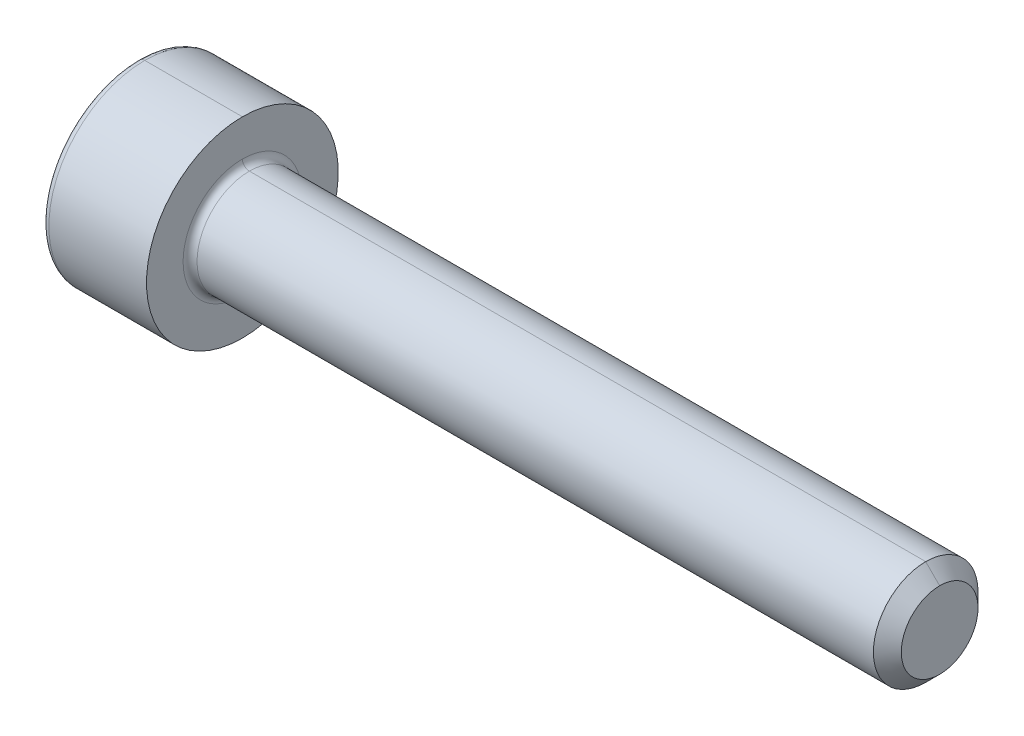
ISO-10303-21;
HEADER;
FILE_DESCRIPTION(('STEP AP214'),'2;1');
FILE_NAME('part.step','',(''),(''),'','','');
FILE_SCHEMA(('AUTOMOTIVE_DESIGN { 1 0 10303 214 1 1 1 1 }'));
ENDSEC;
DATA;
#1=APPLICATION_CONTEXT('core data for automotive mechanical design processes');
#2=APPLICATION_PROTOCOL_DEFINITION('international standard','automotive_design',2000,#1);
#3=PRODUCT_CONTEXT('',#1,'mechanical');
#4=PRODUCT('Part','Part','',(#3));
#5=PRODUCT_RELATED_PRODUCT_CATEGORY('part','',(#4));
#6=PRODUCT_DEFINITION_FORMATION('','',#4);
#7=PRODUCT_DEFINITION_CONTEXT('part definition',#1,'design');
#8=PRODUCT_DEFINITION('design','',#6,#7);
#9=PRODUCT_DEFINITION_SHAPE('','',#8);
#10=(LENGTH_UNIT() NAMED_UNIT(*) SI_UNIT(.MILLI.,.METRE.));
#11=(NAMED_UNIT(*) PLANE_ANGLE_UNIT() SI_UNIT($,.RADIAN.));
#12=(NAMED_UNIT(*) SI_UNIT($,.STERADIAN.) SOLID_ANGLE_UNIT());
#13=UNCERTAINTY_MEASURE_WITH_UNIT(LENGTH_MEASURE(1.E-05),#10,'distance_accuracy_value','');
#14=(GEOMETRIC_REPRESENTATION_CONTEXT(3) GLOBAL_UNCERTAINTY_ASSIGNED_CONTEXT((#13)) GLOBAL_UNIT_ASSIGNED_CONTEXT((#10,
#11,#12)) REPRESENTATION_CONTEXT('',''));
#15=CARTESIAN_POINT('',(0.,0.,0.));
#16=DIRECTION('',(0.,0.,1.));
#17=DIRECTION('',(1.,0.,0.));
#18=AXIS2_PLACEMENT_3D('',#15,#16,#17);
#19=CARTESIAN_POINT('',(1.50000000000084,3.74700270810991E-13,-3.74700270810991E-13));
#20=DIRECTION('',(-1.,0.,0.));
#21=DIRECTION('',(0.,0.,1.));
#22=AXIS2_PLACEMENT_3D('',#19,#20,#21);
#23=PLANE('',#22);
#24=DIRECTION('',(0.,-0.866025403784439,0.5));
#25=VECTOR('',#24,1.);
#26=CARTESIAN_POINT('',(1.50000000000105,9.85322934354826E-13,-1.44337567297408));
#27=LINE('',#26,#25);
#28=CARTESIAN_POINT('',(1.50000000000105,9.85322934354826E-13,-1.44337567297408));
#29=VERTEX_POINT('',#28);
#30=CARTESIAN_POINT('',(1.50000000000028,-1.24999999999915,-0.721687836487003));
#31=VERTEX_POINT('',#30);
#32=EDGE_CURVE('E254',#29,#31,#27,.T.);
#33=ORIENTED_EDGE('',*,*,#32,.T.);
#34=DIRECTION('',(0.,0.,1.));
#35=VECTOR('',#34,1.);
#36=CARTESIAN_POINT('',(1.50000000000028,-1.24999999999915,-0.721687836487003));
#37=LINE('',#36,#35);
#38=CARTESIAN_POINT('',(1.50000000000039,-1.24999999999961,0.721687836486698));
#39=VERTEX_POINT('',#38);
#40=EDGE_CURVE('E11',#31,#39,#37,.T.);
#41=ORIENTED_EDGE('',*,*,#40,.T.);
#42=DIRECTION('',(0.,0.86602540378444,0.5));
#43=VECTOR('',#42,1.);
#44=CARTESIAN_POINT('',(1.50000000000039,-1.24999999999961,0.721687836486698));
#45=LINE('',#44,#43);
#46=CARTESIAN_POINT('',(1.5000000000005,7.49400541621981E-13,1.44337567297381));
#47=VERTEX_POINT('',#46);
#48=EDGE_CURVE('E43',#39,#47,#45,.T.);
#49=ORIENTED_EDGE('',*,*,#48,.T.);
#50=DIRECTION('',(0.,0.866025403784439,-0.5));
#51=VECTOR('',#50,1.);
#52=CARTESIAN_POINT('',(1.5000000000005,7.49400541621981E-13,1.44337567297381));
#53=LINE('',#52,#51);
#54=CARTESIAN_POINT('',(1.50000000000072,1.25000000000063,0.721687836486684));
#55=VERTEX_POINT('',#54);
#56=EDGE_CURVE('E287',#47,#55,#53,.T.);
#57=ORIENTED_EDGE('',*,*,#56,.T.);
#58=DIRECTION('',(0.,0.,-1.));
#59=VECTOR('',#58,1.);
#60=CARTESIAN_POINT('',(1.50000000000072,1.25000000000063,0.721687836486684));
#61=LINE('',#60,#59);
#62=CARTESIAN_POINT('',(1.50000000000105,1.25000000000044,-0.721687836486976));
#63=VERTEX_POINT('',#62);
#64=EDGE_CURVE('E269',#55,#63,#61,.T.);
#65=ORIENTED_EDGE('',*,*,#64,.T.);
#66=DIRECTION('',(0.,-0.866025403784439,-0.5));
#67=VECTOR('',#66,1.);
#68=CARTESIAN_POINT('',(1.50000000000105,1.25000000000044,-0.721687836486976));
#69=LINE('',#68,#67);
#70=EDGE_CURVE('E247',#63,#29,#69,.T.);
#71=ORIENTED_EDGE('',*,*,#70,.T.);
#72=EDGE_LOOP('',(#33,#41,#49,#57,#65,#71));
#73=FACE_BOUND('',#72,.T.);
#74=ADVANCED_FACE('F16',(#73),#23,.T.);
#75=CARTESIAN_POINT('',(1.50000000000028,-1.24999999999915,-0.721687836487003));
#76=DIRECTION('',(0.,-1.,0.));
#77=DIRECTION('',(-1.,0.,0.));
#78=AXIS2_PLACEMENT_3D('',#75,#76,#77);
#79=PLANE('',#78);
#80=DIRECTION('',(0.,0.,1.));
#81=VECTOR('',#80,1.);
#82=CARTESIAN_POINT('',(8.88178419700125E-13,-1.2499999999995,-0.721687836486781));
#83=LINE('',#82,#81);
#84=CARTESIAN_POINT('',(8.88178419700125E-13,-1.2499999999995,-0.721687836486781));
#85=VERTEX_POINT('',#84);
#86=CARTESIAN_POINT('',(7.7715611723761E-13,-1.24999999999904,0.721687836486989));
#87=VERTEX_POINT('',#86);
#88=EDGE_CURVE('E258',#85,#87,#83,.T.);
#89=ORIENTED_EDGE('',*,*,#88,.T.);
#90=DIRECTION('',(-1.,0.,0.));
#91=VECTOR('',#90,1.);
#92=CARTESIAN_POINT('',(1.50000000000039,-1.24999999999961,0.721687836486698));
#93=LINE('',#92,#91);
#94=EDGE_CURVE('E24',#39,#87,#93,.T.);
#95=ORIENTED_EDGE('',*,*,#94,.F.);
#96=ORIENTED_EDGE('',*,*,#40,.F.);
#97=DIRECTION('',(-1.,0.,0.));
#98=VECTOR('',#97,1.);
#99=CARTESIAN_POINT('',(1.50000000000028,-1.24999999999915,-0.721687836487003));
#100=LINE('',#99,#98);
#101=EDGE_CURVE('E151',#31,#85,#100,.T.);
#102=ORIENTED_EDGE('',*,*,#101,.T.);
#103=EDGE_LOOP('',(#89,#95,#96,#102));
#104=FACE_BOUND('',#103,.T.);
#105=ADVANCED_FACE('F476',(#104),#79,.F.);
#106=CARTESIAN_POINT('',(1.50000000000039,-1.24999999999961,0.721687836486698));
#107=DIRECTION('',(0.,-0.5,0.86602540378444));
#108=DIRECTION('',(-1.,0.,0.));
#109=AXIS2_PLACEMENT_3D('',#106,#107,#108);
#110=PLANE('',#109);
#111=DIRECTION('',(0.,0.86602540378444,0.5));
#112=VECTOR('',#111,1.);
#113=CARTESIAN_POINT('',(7.7715611723761E-13,-1.24999999999904,0.721687836486989));
#114=LINE('',#113,#112);
#115=CARTESIAN_POINT('',(-2.22044604925032E-13,0.,1.44337567297408));
#116=VERTEX_POINT('',#115);
#117=EDGE_CURVE('E246',#87,#116,#114,.T.);
#118=ORIENTED_EDGE('',*,*,#117,.T.);
#119=DIRECTION('',(-1.,0.,0.));
#120=VECTOR('',#119,1.);
#121=CARTESIAN_POINT('',(1.5000000000005,7.49400541621981E-13,1.44337567297381));
#122=LINE('',#121,#120);
#123=EDGE_CURVE('E290',#47,#116,#122,.T.);
#124=ORIENTED_EDGE('',*,*,#123,.F.);
#125=ORIENTED_EDGE('',*,*,#48,.F.);
#126=ORIENTED_EDGE('',*,*,#94,.T.);
#127=EDGE_LOOP('',(#118,#124,#125,#126));
#128=FACE_BOUND('',#127,.T.);
#129=ADVANCED_FACE('F466',(#128),#110,.F.);
#130=CARTESIAN_POINT('',(1.5000000000005,7.49400541621981E-13,1.44337567297381));
#131=DIRECTION('',(0.,0.5,0.866025403784439));
#132=DIRECTION('',(1.,0.,0.));
#133=AXIS2_PLACEMENT_3D('',#130,#131,#132);
#134=PLANE('',#133);
#135=DIRECTION('',(0.,0.866025403784439,-0.5));
#136=VECTOR('',#135,1.);
#137=CARTESIAN_POINT('',(-2.22044604925032E-13,0.,1.44337567297408));
#138=LINE('',#137,#136);
#139=CARTESIAN_POINT('',(5.55111512312578E-13,1.25000000000058,0.721687836486684));
#140=VERTEX_POINT('',#139);
#141=EDGE_CURVE('E242',#116,#140,#138,.T.);
#142=ORIENTED_EDGE('',*,*,#141,.T.);
#143=DIRECTION('',(-1.,0.,0.));
#144=VECTOR('',#143,1.);
#145=CARTESIAN_POINT('',(1.50000000000072,1.25000000000063,0.721687836486684));
#146=LINE('',#145,#144);
#147=EDGE_CURVE('E272',#55,#140,#146,.T.);
#148=ORIENTED_EDGE('',*,*,#147,.F.);
#149=ORIENTED_EDGE('',*,*,#56,.F.);
#150=ORIENTED_EDGE('',*,*,#123,.T.);
#151=EDGE_LOOP('',(#142,#148,#149,#150));
#152=FACE_BOUND('',#151,.T.);
#153=ADVANCED_FACE('F456',(#152),#134,.F.);
#154=CARTESIAN_POINT('',(1.50000000000072,1.25000000000063,0.721687836486684));
#155=DIRECTION('',(0.,1.,0.));
#156=DIRECTION('',(1.,0.,0.));
#157=AXIS2_PLACEMENT_3D('',#154,#155,#156);
#158=PLANE('',#157);
#159=DIRECTION('',(0.,0.,-1.));
#160=VECTOR('',#159,1.);
#161=CARTESIAN_POINT('',(5.55111512312578E-13,1.25000000000058,0.721687836486684));
#162=LINE('',#161,#160);
#163=CARTESIAN_POINT('',(7.7715611723761E-13,1.2500000000006,-0.721687836487114));
#164=VERTEX_POINT('',#163);
#165=EDGE_CURVE('E232',#140,#164,#162,.T.);
#166=ORIENTED_EDGE('',*,*,#165,.T.);
#167=DIRECTION('',(-1.,0.,0.));
#168=VECTOR('',#167,1.);
#169=CARTESIAN_POINT('',(1.50000000000105,1.25000000000044,-0.721687836486976));
#170=LINE('',#169,#168);
#171=EDGE_CURVE('E250',#63,#164,#170,.T.);
#172=ORIENTED_EDGE('',*,*,#171,.F.);
#173=ORIENTED_EDGE('',*,*,#64,.F.);
#174=ORIENTED_EDGE('',*,*,#147,.T.);
#175=EDGE_LOOP('',(#166,#172,#173,#174));
#176=FACE_BOUND('',#175,.T.);
#177=ADVANCED_FACE('F446',(#176),#158,.F.);
#178=CARTESIAN_POINT('',(1.50000000000105,1.25000000000044,-0.721687836486976));
#179=DIRECTION('',(0.,0.5,-0.86602540378444));
#180=DIRECTION('',(-1.,0.,0.));
#181=AXIS2_PLACEMENT_3D('',#178,#179,#180);
#182=PLANE('',#181);
#183=DIRECTION('',(0.,-0.866025403784439,-0.5));
#184=VECTOR('',#183,1.);
#185=CARTESIAN_POINT('',(7.7715611723761E-13,1.2500000000006,-0.721687836487114));
#186=LINE('',#185,#184);
#187=CARTESIAN_POINT('',(1.33226762955019E-12,1.0547118733939E-12,-1.44337567297398));
#188=VERTEX_POINT('',#187);
#189=EDGE_CURVE('E228',#164,#188,#186,.T.);
#190=ORIENTED_EDGE('',*,*,#189,.T.);
#191=DIRECTION('',(-1.,0.,0.));
#192=VECTOR('',#191,1.);
#193=CARTESIAN_POINT('',(1.50000000000105,9.85322934354826E-13,-1.44337567297408));
#194=LINE('',#193,#192);
#195=EDGE_CURVE('E251',#29,#188,#194,.T.);
#196=ORIENTED_EDGE('',*,*,#195,.F.);
#197=ORIENTED_EDGE('',*,*,#70,.F.);
#198=ORIENTED_EDGE('',*,*,#171,.T.);
#199=EDGE_LOOP('',(#190,#196,#197,#198));
#200=FACE_BOUND('',#199,.T.);
#201=ADVANCED_FACE('F436',(#200),#182,.F.);
#202=CARTESIAN_POINT('',(1.50000000000105,9.85322934354826E-13,-1.44337567297408));
#203=DIRECTION('',(0.,-0.5,-0.866025403784439));
#204=DIRECTION('',(0.,-0.866025403784439,0.5));
#205=AXIS2_PLACEMENT_3D('',#202,#203,#204);
#206=PLANE('',#205);
#207=DIRECTION('',(0.,-0.866025403784439,0.5));
#208=VECTOR('',#207,1.);
#209=CARTESIAN_POINT('',(1.33226762955019E-12,1.0547118733939E-12,-1.44337567297398));
#210=LINE('',#209,#208);
#211=EDGE_CURVE('E233',#188,#85,#210,.T.);
#212=ORIENTED_EDGE('',*,*,#211,.T.);
#213=ORIENTED_EDGE('',*,*,#101,.F.);
#214=ORIENTED_EDGE('',*,*,#32,.F.);
#215=ORIENTED_EDGE('',*,*,#195,.T.);
#216=EDGE_LOOP('',(#212,#213,#214,#215));
#217=FACE_BOUND('',#216,.T.);
#218=ADVANCED_FACE('F352',(#217),#206,.F.);
#219=CARTESIAN_POINT('',(23.000000000001,1.10000000000103,-4.85722573273506E-13));
#220=DIRECTION('',(1.,0.,0.));
#221=DIRECTION('',(0.,-1.,0.));
#222=AXIS2_PLACEMENT_3D('',#219,#220,#221);
#223=PLANE('',#222);
#224=CARTESIAN_POINT('',(23.0000000000004,4.99600361081321E-13,-4.02455846426619E-13));
#225=DIRECTION('',(1.,0.,0.));
#226=DIRECTION('',(0.,1.,0.));
#227=AXIS2_PLACEMENT_3D('',#224,#225,#226);
#228=CIRCLE('',#227,1.1);
#229=CARTESIAN_POINT('',(23.0000000000004,-1.0999999999995,-4.01983882729897E-13));
#230=VERTEX_POINT('',#229);
#231=CARTESIAN_POINT('',(23.0000000000004,1.1000000000005,-4.03267968578021E-13));
#232=VERTEX_POINT('',#231);
#233=EDGE_CURVE('E142',#230,#232,#228,.T.);
#234=ORIENTED_EDGE('',*,*,#233,.T.);
#235=CARTESIAN_POINT('',(23.0000000000004,4.99600361081321E-13,-4.02455846426619E-13));
#236=DIRECTION('',(1.,0.,0.));
#237=DIRECTION('',(0.,1.,0.));
#238=AXIS2_PLACEMENT_3D('',#235,#236,#237);
#239=CIRCLE('',#238,1.1);
#240=EDGE_CURVE('E146',#232,#230,#239,.T.);
#241=ORIENTED_EDGE('',*,*,#240,.T.);
#242=EDGE_LOOP('',(#234,#241));
#243=FACE_BOUND('',#242,.T.);
#244=ADVANCED_FACE('F144',(#243),#223,.T.);
#245=CARTESIAN_POINT('',(23.0000000000004,4.99600361081321E-13,-4.02455846426619E-13));
#246=DIRECTION('',(-1.,0.,0.));
#247=DIRECTION('',(0.,-1.,0.));
#248=AXIS2_PLACEMENT_3D('',#245,#246,#247);
#249=CONICAL_SURFACE('',#248,1.1,0.785398163397447);
#250=DIRECTION('',(-0.707106781186551,0.707106781186545,0.));
#251=VECTOR('',#250,1.);
#252=CARTESIAN_POINT('',(23.0000000000004,1.1000000000005,-4.02931757942257E-13));
#253=LINE('',#252,#251);
#254=CARTESIAN_POINT('',(22.6000000000003,1.50000000000076,0.));
#255=VERTEX_POINT('',#254);
#256=EDGE_CURVE('E155',#232,#255,#253,.T.);
#257=ORIENTED_EDGE('',*,*,#256,.F.);
#258=ORIENTED_EDGE('',*,*,#233,.F.);
#259=DIRECTION('',(-0.707106781186551,-0.707106781186544,0.));
#260=VECTOR('',#259,1.);
#261=CARTESIAN_POINT('',(23.0000000000004,-1.0999999999995,-4.01845223763076E-13));
#262=LINE('',#261,#260);
#263=CARTESIAN_POINT('',(22.6000000000003,-1.49999999999924,-4.14048386237099E-13));
#264=VERTEX_POINT('',#263);
#265=EDGE_CURVE('E164',#230,#264,#262,.T.);
#266=ORIENTED_EDGE('',*,*,#265,.T.);
#267=CARTESIAN_POINT('',(22.6000000000003,7.63278329429795E-13,0.));
#268=DIRECTION('',(1.,0.,0.));
#269=DIRECTION('',(0.,1.,0.));
#270=AXIS2_PLACEMENT_3D('',#267,#268,#269);
#271=CIRCLE('',#270,1.5);
#272=EDGE_CURVE('E152',#264,#255,#271,.T.);
#273=ORIENTED_EDGE('',*,*,#272,.T.);
#274=EDGE_LOOP('',(#257,#258,#266,#273));
#275=FACE_BOUND('',#274,.T.);
#276=ADVANCED_FACE('F156',(#275),#249,.T.);
#277=CARTESIAN_POINT('',(23.0000000000004,4.99600361081321E-13,-4.02455846426619E-13));
#278=DIRECTION('',(1.,0.,0.));
#279=DIRECTION('',(0.,1.,0.));
#280=AXIS2_PLACEMENT_3D('',#277,#278,#279);
#281=CYLINDRICAL_SURFACE('',#280,1.5);
#282=DIRECTION('',(1.,0.,0.));
#283=VECTOR('',#282,1.);
#284=CARTESIAN_POINT('',(23.0000000000004,-1.49999999999949,-4.01439482138278E-13));
#285=LINE('',#284,#283);
#286=CARTESIAN_POINT('',(3.2000000000001,-1.49999999999961,0.));
#287=VERTEX_POINT('',#286);
#288=EDGE_CURVE('E191',#287,#264,#285,.T.);
#289=ORIENTED_EDGE('',*,*,#288,.F.);
#290=CARTESIAN_POINT('',(3.20000000000009,3.88578058618805E-13,0.));
#291=DIRECTION('',(1.,0.,0.));
#292=DIRECTION('',(0.,1.,0.));
#293=AXIS2_PLACEMENT_3D('',#290,#291,#292);
#294=CIRCLE('',#293,1.5);
#295=CARTESIAN_POINT('',(3.2000000000001,1.50000000000039,0.));
#296=VERTEX_POINT('',#295);
#297=EDGE_CURVE('E195',#287,#296,#294,.T.);
#298=ORIENTED_EDGE('',*,*,#297,.T.);
#299=DIRECTION('',(1.,0.,0.));
#300=VECTOR('',#299,1.);
#301=CARTESIAN_POINT('',(23.0000000000004,1.5000000000005,-4.03288513695089E-13));
#302=LINE('',#301,#300);
#303=EDGE_CURVE('E192',#296,#255,#302,.T.);
#304=ORIENTED_EDGE('',*,*,#303,.T.);
#305=ORIENTED_EDGE('',*,*,#272,.F.);
#306=EDGE_LOOP('',(#289,#298,#304,#305));
#307=FACE_BOUND('',#306,.T.);
#308=ADVANCED_FACE('F388',(#307),#281,.T.);
#309=CARTESIAN_POINT('',(3.20000000000009,3.88578058618805E-13,0.));
#310=DIRECTION('',(1.,0.,0.));
#311=DIRECTION('',(0.,1.,0.));
#312=AXIS2_PLACEMENT_3D('',#309,#310,#311);
#313=TOROIDAL_SURFACE('',#312,1.7,0.2);
#314=CARTESIAN_POINT('',(3.20000000000009,-1.6999999999996,0.));
#315=DIRECTION('',(0.,0.,1.));
#316=DIRECTION('',(1.,0.,0.));
#317=AXIS2_PLACEMENT_3D('',#314,#315,#316);
#318=CIRCLE('',#317,0.2);
#319=CARTESIAN_POINT('',(3.00000000000038,-1.69999999999968,0.));
#320=VERTEX_POINT('',#319);
#321=EDGE_CURVE('E199',#287,#320,#318,.T.);
#322=ORIENTED_EDGE('',*,*,#321,.F.);
#323=CARTESIAN_POINT('',(3.20000000000009,3.88578058618805E-13,0.));
#324=DIRECTION('',(1.,0.,0.));
#325=DIRECTION('',(0.,1.,0.));
#326=AXIS2_PLACEMENT_3D('',#323,#324,#325);
#327=CIRCLE('',#326,1.5);
#328=EDGE_CURVE('E187',#296,#287,#327,.T.);
#329=ORIENTED_EDGE('',*,*,#328,.F.);
#330=CARTESIAN_POINT('',(3.2000000000001,1.70000000000038,0.));
#331=DIRECTION('',(0.,0.,-1.));
#332=DIRECTION('',(-1.,0.,0.));
#333=AXIS2_PLACEMENT_3D('',#330,#331,#332);
#334=CIRCLE('',#333,0.2);
#335=CARTESIAN_POINT('',(3.00000000000039,1.70000000000031,0.));
#336=VERTEX_POINT('',#335);
#337=EDGE_CURVE('E177',#296,#336,#334,.T.);
#338=ORIENTED_EDGE('',*,*,#337,.T.);
#339=CARTESIAN_POINT('',(3.00000000000067,2.35922392732846E-13,-2.77555756156289E-13));
#340=DIRECTION('',(1.,0.,0.));
#341=DIRECTION('',(0.,1.,0.));
#342=AXIS2_PLACEMENT_3D('',#339,#340,#341);
#343=CIRCLE('',#342,1.7);
#344=EDGE_CURVE('E268',#336,#320,#343,.T.);
#345=ORIENTED_EDGE('',*,*,#344,.T.);
#346=EDGE_LOOP('',(#322,#329,#338,#345));
#347=FACE_BOUND('',#346,.T.);
#348=ADVANCED_FACE('F322',(#347),#313,.F.);
#349=CARTESIAN_POINT('',(3.00000000000078,2.75000000000019,-2.91433543964103E-13));
#350=DIRECTION('',(1.,0.,0.));
#351=DIRECTION('',(0.,-1.,0.));
#352=AXIS2_PLACEMENT_3D('',#349,#350,#351);
#353=PLANE('',#352);
#354=ORIENTED_EDGE('',*,*,#344,.F.);
#355=CARTESIAN_POINT('',(3.00000000000067,2.35922392732846E-13,-2.77555756156289E-13));
#356=DIRECTION('',(1.,0.,0.));
#357=DIRECTION('',(0.,1.,0.));
#358=AXIS2_PLACEMENT_3D('',#355,#356,#357);
#359=CIRCLE('',#358,1.7);
#360=EDGE_CURVE('E203',#320,#336,#359,.T.);
#361=ORIENTED_EDGE('',*,*,#360,.F.);
#362=EDGE_LOOP('',(#354,#361));
#363=FACE_BOUND('',#362,.T.);
#364=CARTESIAN_POINT('',(3.00000000000067,2.35922392732846E-13,-2.77555756156289E-13));
#365=DIRECTION('',(1.,0.,0.));
#366=DIRECTION('',(0.,1.,0.));
#367=AXIS2_PLACEMENT_3D('',#364,#365,#366);
#368=CIRCLE('',#367,2.75);
#369=CARTESIAN_POINT('',(3.00000000000068,2.75000000000023,-2.79082312815149E-13));
#370=VERTEX_POINT('',#369);
#371=CARTESIAN_POINT('',(3.00000000000068,-2.74999999999976,-4.27308407711418E-13));
#372=VERTEX_POINT('',#371);
#373=EDGE_CURVE('E184',#370,#372,#368,.T.);
#374=ORIENTED_EDGE('',*,*,#373,.T.);
#375=CARTESIAN_POINT('',(3.00000000000067,2.35922392732846E-13,-2.77555756156289E-13));
#376=DIRECTION('',(1.,0.,0.));
#377=DIRECTION('',(0.,1.,0.));
#378=AXIS2_PLACEMENT_3D('',#375,#376,#377);
#379=CIRCLE('',#378,2.75);
#380=EDGE_CURVE('E265',#372,#370,#379,.T.);
#381=ORIENTED_EDGE('',*,*,#380,.T.);
#382=EDGE_LOOP('',(#374,#381));
#383=FACE_BOUND('',#382,.T.);
#384=ADVANCED_FACE('F317',(#363,#383),#353,.T.);
#385=CARTESIAN_POINT('',(23.0000000000004,4.99600361081321E-13,-4.02455846426619E-13));
#386=DIRECTION('',(1.,0.,0.));
#387=DIRECTION('',(0.,1.,0.));
#388=AXIS2_PLACEMENT_3D('',#385,#386,#387);
#389=CYLINDRICAL_SURFACE('',#388,2.75);
#390=DIRECTION('',(1.,0.,0.));
#391=VECTOR('',#390,1.);
#392=CARTESIAN_POINT('',(23.0000000000004,-2.7499999999995,-4.00592511897994E-13));
#393=LINE('',#392,#391);
#394=CARTESIAN_POINT('',(0.2000000000002,-2.74999999999928,0.));
#395=VERTEX_POINT('',#394);
#396=EDGE_CURVE('E176',#395,#372,#393,.T.);
#397=ORIENTED_EDGE('',*,*,#396,.F.);
#398=CARTESIAN_POINT('',(0.2000000000002,7.07767178198537E-13,0.));
#399=DIRECTION('',(1.,0.,0.));
#400=DIRECTION('',(0.,1.,0.));
#401=AXIS2_PLACEMENT_3D('',#398,#399,#400);
#402=CIRCLE('',#401,2.75);
#403=CARTESIAN_POINT('',(0.2000000000002,2.7500000000007,0.));
#404=VERTEX_POINT('',#403);
#405=EDGE_CURVE('E262',#395,#404,#402,.T.);
#406=ORIENTED_EDGE('',*,*,#405,.T.);
#407=DIRECTION('',(1.,0.,0.));
#408=VECTOR('',#407,1.);
#409=CARTESIAN_POINT('',(23.0000000000004,2.75000000000049,-4.03982403085479E-13));
#410=LINE('',#409,#408);
#411=EDGE_CURVE('E179',#404,#370,#410,.T.);
#412=ORIENTED_EDGE('',*,*,#411,.T.);
#413=ORIENTED_EDGE('',*,*,#380,.F.);
#414=EDGE_LOOP('',(#397,#406,#412,#413));
#415=FACE_BOUND('',#414,.T.);
#416=ADVANCED_FACE('F321',(#415),#389,.T.);
#417=CARTESIAN_POINT('',(0.2000000000002,7.07767178198537E-13,0.));
#418=DIRECTION('',(1.,0.,0.));
#419=DIRECTION('',(0.,1.,0.));
#420=AXIS2_PLACEMENT_3D('',#417,#418,#419);
#421=TOROIDAL_SURFACE('',#420,2.55,0.2);
#422=CARTESIAN_POINT('',(0.200000000000194,-2.54999999999928,0.));
#423=DIRECTION('',(0.,0.,1.));
#424=DIRECTION('',(1.,0.,0.));
#425=AXIS2_PLACEMENT_3D('',#422,#423,#424);
#426=CIRCLE('',#425,0.2);
#427=CARTESIAN_POINT('',(0.,-2.55,0.));
#428=VERTEX_POINT('',#427);
#429=EDGE_CURVE('E210',#428,#395,#426,.T.);
#430=ORIENTED_EDGE('',*,*,#429,.F.);
#431=CARTESIAN_POINT('',(0.,0.,0.));
#432=DIRECTION('',(1.,0.,0.));
#433=DIRECTION('',(0.,1.,0.));
#434=AXIS2_PLACEMENT_3D('',#431,#432,#433);
#435=CIRCLE('',#434,2.55);
#436=CARTESIAN_POINT('',(0.,2.55,0.));
#437=VERTEX_POINT('',#436);
#438=EDGE_CURVE('E227',#428,#437,#435,.T.);
#439=ORIENTED_EDGE('',*,*,#438,.T.);
#440=CARTESIAN_POINT('',(0.200000000000207,2.5500000000007,0.));
#441=DIRECTION('',(0.,0.,-1.));
#442=DIRECTION('',(-1.,0.,0.));
#443=AXIS2_PLACEMENT_3D('',#440,#441,#442);
#444=CIRCLE('',#443,0.2);
#445=EDGE_CURVE('E223',#437,#404,#444,.T.);
#446=ORIENTED_EDGE('',*,*,#445,.T.);
#447=ORIENTED_EDGE('',*,*,#405,.F.);
#448=EDGE_LOOP('',(#430,#439,#446,#447));
#449=FACE_BOUND('',#448,.T.);
#450=ADVANCED_FACE('F381',(#449),#421,.T.);
#451=CARTESIAN_POINT('',(0.,0.,0.));
#452=DIRECTION('',(-1.,0.,0.));
#453=DIRECTION('',(0.,0.,1.));
#454=AXIS2_PLACEMENT_3D('',#451,#452,#453);
#455=PLANE('',#454);
#456=ORIENTED_EDGE('',*,*,#211,.F.);
#457=ORIENTED_EDGE('',*,*,#189,.F.);
#458=ORIENTED_EDGE('',*,*,#165,.F.);
#459=ORIENTED_EDGE('',*,*,#141,.F.);
#460=ORIENTED_EDGE('',*,*,#117,.F.);
#461=ORIENTED_EDGE('',*,*,#88,.F.);
#462=EDGE_LOOP('',(#456,#457,#458,#459,#460,#461));
#463=FACE_BOUND('',#462,.T.);
#464=CARTESIAN_POINT('',(0.,0.,0.));
#465=DIRECTION('',(1.,0.,0.));
#466=DIRECTION('',(0.,1.,0.));
#467=AXIS2_PLACEMENT_3D('',#464,#465,#466);
#468=CIRCLE('',#467,2.55);
#469=EDGE_CURVE('E183',#437,#428,#468,.T.);
#470=ORIENTED_EDGE('',*,*,#469,.F.);
#471=ORIENTED_EDGE('',*,*,#438,.F.);
#472=EDGE_LOOP('',(#470,#471));
#473=FACE_BOUND('',#472,.T.);
#474=ADVANCED_FACE('F371',(#463,#473),#455,.T.);
#475=CARTESIAN_POINT('',(0.2000000000002,7.07767178198537E-13,0.));
#476=DIRECTION('',(1.,0.,0.));
#477=DIRECTION('',(0.,1.,0.));
#478=AXIS2_PLACEMENT_3D('',#475,#476,#477);
#479=TOROIDAL_SURFACE('',#478,2.55,0.2);
#480=ORIENTED_EDGE('',*,*,#469,.T.);
#481=ORIENTED_EDGE('',*,*,#429,.T.);
#482=CARTESIAN_POINT('',(0.2000000000002,7.07767178198537E-13,0.));
#483=DIRECTION('',(1.,0.,0.));
#484=DIRECTION('',(0.,1.,0.));
#485=AXIS2_PLACEMENT_3D('',#482,#483,#484);
#486=CIRCLE('',#485,2.75);
#487=EDGE_CURVE('E174',#404,#395,#486,.T.);
#488=ORIENTED_EDGE('',*,*,#487,.F.);
#489=ORIENTED_EDGE('',*,*,#445,.F.);
#490=EDGE_LOOP('',(#480,#481,#488,#489));
#491=FACE_BOUND('',#490,.T.);
#492=ADVANCED_FACE('F361',(#491),#479,.T.);
#493=CARTESIAN_POINT('',(23.0000000000004,4.99600361081321E-13,-4.02455846426619E-13));
#494=DIRECTION('',(1.,0.,0.));
#495=DIRECTION('',(0.,1.,0.));
#496=AXIS2_PLACEMENT_3D('',#493,#494,#495);
#497=CYLINDRICAL_SURFACE('',#496,2.75);
#498=ORIENTED_EDGE('',*,*,#487,.T.);
#499=ORIENTED_EDGE('',*,*,#396,.T.);
#500=ORIENTED_EDGE('',*,*,#373,.F.);
#501=ORIENTED_EDGE('',*,*,#411,.F.);
#502=EDGE_LOOP('',(#498,#499,#500,#501));
#503=FACE_BOUND('',#502,.T.);
#504=ADVANCED_FACE('F342',(#503),#497,.T.);
#505=CARTESIAN_POINT('',(3.20000000000009,3.88578058618805E-13,0.));
#506=DIRECTION('',(1.,0.,0.));
#507=DIRECTION('',(0.,1.,0.));
#508=AXIS2_PLACEMENT_3D('',#505,#506,#507);
#509=TOROIDAL_SURFACE('',#508,1.7,0.2);
#510=ORIENTED_EDGE('',*,*,#297,.F.);
#511=ORIENTED_EDGE('',*,*,#321,.T.);
#512=ORIENTED_EDGE('',*,*,#360,.T.);
#513=ORIENTED_EDGE('',*,*,#337,.F.);
#514=EDGE_LOOP('',(#510,#511,#512,#513));
#515=FACE_BOUND('',#514,.T.);
#516=ADVANCED_FACE('F332',(#515),#509,.F.);
#517=CARTESIAN_POINT('',(23.0000000000004,4.99600361081321E-13,-4.02455846426619E-13));
#518=DIRECTION('',(1.,0.,0.));
#519=DIRECTION('',(0.,1.,0.));
#520=AXIS2_PLACEMENT_3D('',#517,#518,#519);
#521=CYLINDRICAL_SURFACE('',#520,1.5);
#522=ORIENTED_EDGE('',*,*,#328,.T.);
#523=ORIENTED_EDGE('',*,*,#288,.T.);
#524=CARTESIAN_POINT('',(22.6000000000003,7.63278329429795E-13,0.));
#525=DIRECTION('',(1.,0.,0.));
#526=DIRECTION('',(0.,1.,0.));
#527=AXIS2_PLACEMENT_3D('',#524,#525,#526);
#528=CIRCLE('',#527,1.5);
#529=EDGE_CURVE('E161',#255,#264,#528,.T.);
#530=ORIENTED_EDGE('',*,*,#529,.F.);
#531=ORIENTED_EDGE('',*,*,#303,.F.);
#532=EDGE_LOOP('',(#522,#523,#530,#531));
#533=FACE_BOUND('',#532,.T.);
#534=ADVANCED_FACE('F310',(#533),#521,.T.);
#535=CARTESIAN_POINT('',(23.0000000000004,4.99600361081321E-13,-4.02455846426619E-13));
#536=DIRECTION('',(-1.,0.,0.));
#537=DIRECTION('',(0.,-1.,0.));
#538=AXIS2_PLACEMENT_3D('',#535,#536,#537);
#539=CONICAL_SURFACE('',#538,1.1,0.785398163397447);
#540=ORIENTED_EDGE('',*,*,#240,.F.);
#541=ORIENTED_EDGE('',*,*,#256,.T.);
#542=ORIENTED_EDGE('',*,*,#529,.T.);
#543=ORIENTED_EDGE('',*,*,#265,.F.);
#544=EDGE_LOOP('',(#540,#541,#542,#543));
#545=FACE_BOUND('',#544,.T.);
#546=ADVANCED_FACE('F163',(#545),#539,.T.);
#547=CLOSED_SHELL('',(#74,#105,#129,#153,#177,#201,#218,#244,#276,#308,#348,#384,#416,#450,#474,
#492,#504,#516,#534,#546));
#548=MANIFOLD_SOLID_BREP('B1',#547);
#549=ADVANCED_BREP_SHAPE_REPRESENTATION('',(#18,#548),#14);
#550=SHAPE_DEFINITION_REPRESENTATION(#9,#549);
ENDSEC;
END-ISO-10303-21;
